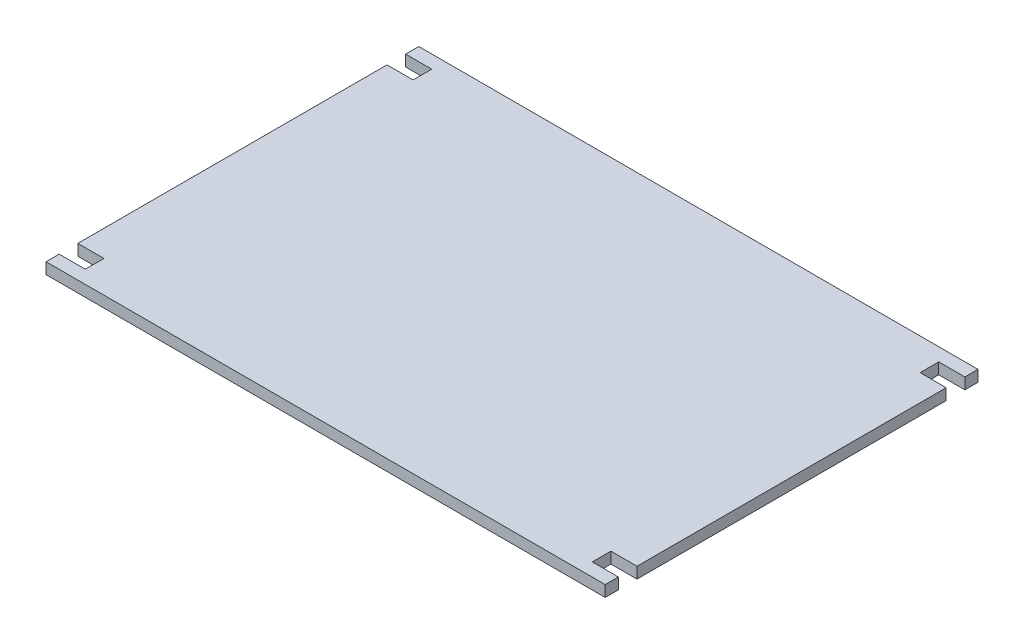
ISO-10303-21;
HEADER;
FILE_DESCRIPTION(('STEP AP214'),'2;1');
FILE_NAME('part.step','',(''),(''),'','','');
FILE_SCHEMA(('AUTOMOTIVE_DESIGN { 1 0 10303 214 1 1 1 1 }'));
ENDSEC;
DATA;
#1=APPLICATION_CONTEXT('core data for automotive mechanical design processes');
#2=APPLICATION_PROTOCOL_DEFINITION('international standard','automotive_design',2000,#1);
#3=PRODUCT_CONTEXT('',#1,'mechanical');
#4=PRODUCT('Part','Part','',(#3));
#5=PRODUCT_RELATED_PRODUCT_CATEGORY('part','',(#4));
#6=PRODUCT_DEFINITION_FORMATION('','',#4);
#7=PRODUCT_DEFINITION_CONTEXT('part definition',#1,'design');
#8=PRODUCT_DEFINITION('design','',#6,#7);
#9=PRODUCT_DEFINITION_SHAPE('','',#8);
#10=(LENGTH_UNIT() NAMED_UNIT(*) SI_UNIT(.MILLI.,.METRE.));
#11=(NAMED_UNIT(*) PLANE_ANGLE_UNIT() SI_UNIT($,.RADIAN.));
#12=(NAMED_UNIT(*) SI_UNIT($,.STERADIAN.) SOLID_ANGLE_UNIT());
#13=UNCERTAINTY_MEASURE_WITH_UNIT(LENGTH_MEASURE(1.E-05),#10,'distance_accuracy_value','');
#14=(GEOMETRIC_REPRESENTATION_CONTEXT(3) GLOBAL_UNCERTAINTY_ASSIGNED_CONTEXT((#13)) GLOBAL_UNIT_ASSIGNED_CONTEXT((#10,
#11,#12)) REPRESENTATION_CONTEXT('',''));
#15=CARTESIAN_POINT('',(0.,0.,0.));
#16=DIRECTION('',(0.,0.,1.));
#17=DIRECTION('',(1.,0.,0.));
#18=AXIS2_PLACEMENT_3D('',#15,#16,#17);
#19=CARTESIAN_POINT('',(0.,3.,0.));
#20=DIRECTION('',(1.,0.,0.));
#21=DIRECTION('',(0.,0.,-1.));
#22=AXIS2_PLACEMENT_3D('',#19,#20,#21);
#23=PLANE('',#22);
#24=DIRECTION('',(0.,0.,1.));
#25=VECTOR('',#24,1.);
#26=CARTESIAN_POINT('',(0.,3.,0.));
#27=LINE('',#26,#25);
#28=CARTESIAN_POINT('',(0.,3.,8.53345615239161));
#29=VERTEX_POINT('',#28);
#30=CARTESIAN_POINT('',(0.,3.,91.4665438476085));
#31=VERTEX_POINT('',#30);
#32=EDGE_CURVE('E286',#29,#31,#27,.T.);
#33=ORIENTED_EDGE('',*,*,#32,.F.);
#34=DIRECTION('',(0.,1.,0.));
#35=VECTOR('',#34,1.);
#36=CARTESIAN_POINT('',(0.,0.,8.53345615239161));
#37=LINE('',#36,#35);
#38=CARTESIAN_POINT('',(0.,0.,8.53345615239161));
#39=VERTEX_POINT('',#38);
#40=EDGE_CURVE('E199',#39,#29,#37,.T.);
#41=ORIENTED_EDGE('',*,*,#40,.F.);
#42=DIRECTION('',(0.,0.,1.));
#43=VECTOR('',#42,1.);
#44=CARTESIAN_POINT('',(0.,0.,0.));
#45=LINE('',#44,#43);
#46=CARTESIAN_POINT('',(0.,0.,91.4665438476085));
#47=VERTEX_POINT('',#46);
#48=EDGE_CURVE('E190',#39,#47,#45,.T.);
#49=ORIENTED_EDGE('',*,*,#48,.T.);
#50=DIRECTION('',(0.,1.,0.));
#51=VECTOR('',#50,1.);
#52=CARTESIAN_POINT('',(0.,0.,91.4665438476085));
#53=LINE('',#52,#51);
#54=EDGE_CURVE('E213',#47,#31,#53,.T.);
#55=ORIENTED_EDGE('',*,*,#54,.T.);
#56=EDGE_LOOP('',(#33,#41,#49,#55));
#57=FACE_BOUND('',#56,.T.);
#58=ADVANCED_FACE('F33',(#57),#23,.F.);
#59=CARTESIAN_POINT('',(0.,0.,0.));
#60=VERTEX_POINT('',#59);
#61=CARTESIAN_POINT('',(0.,0.,3.5334561523916));
#62=VERTEX_POINT('',#61);
#63=EDGE_CURVE('E297',#60,#62,#45,.T.);
#64=ORIENTED_EDGE('',*,*,#63,.T.);
#65=DIRECTION('',(0.,1.,0.));
#66=VECTOR('',#65,1.);
#67=CARTESIAN_POINT('',(0.,0.,3.5334561523916));
#68=LINE('',#67,#66);
#69=CARTESIAN_POINT('',(0.,3.,3.5334561523916));
#70=VERTEX_POINT('',#69);
#71=EDGE_CURVE('E202',#62,#70,#68,.T.);
#72=ORIENTED_EDGE('',*,*,#71,.T.);
#73=CARTESIAN_POINT('',(0.,3.,0.));
#74=VERTEX_POINT('',#73);
#75=EDGE_CURVE('E282',#74,#70,#27,.T.);
#76=ORIENTED_EDGE('',*,*,#75,.F.);
#77=DIRECTION('',(0.,-1.,0.));
#78=VECTOR('',#77,1.);
#79=CARTESIAN_POINT('',(0.,3.,0.));
#80=LINE('',#79,#78);
#81=EDGE_CURVE('E296',#74,#60,#80,.T.);
#82=ORIENTED_EDGE('',*,*,#81,.T.);
#83=EDGE_LOOP('',(#64,#72,#76,#82));
#84=FACE_BOUND('',#83,.T.);
#85=ADVANCED_FACE('F351',(#84),#23,.F.);
#86=CARTESIAN_POINT('',(150.,3.,0.));
#87=DIRECTION('',(-1.,0.,0.));
#88=DIRECTION('',(0.,0.,1.));
#89=AXIS2_PLACEMENT_3D('',#86,#87,#88);
#90=PLANE('',#89);
#91=DIRECTION('',(0.,0.,-1.));
#92=VECTOR('',#91,1.);
#93=CARTESIAN_POINT('',(150.,3.,0.));
#94=LINE('',#93,#92);
#95=CARTESIAN_POINT('',(150.,3.,3.53345615239156));
#96=VERTEX_POINT('',#95);
#97=CARTESIAN_POINT('',(150.,3.,0.));
#98=VERTEX_POINT('',#97);
#99=EDGE_CURVE('E289',#96,#98,#94,.T.);
#100=ORIENTED_EDGE('',*,*,#99,.F.);
#101=DIRECTION('',(0.,1.,0.));
#102=VECTOR('',#101,1.);
#103=CARTESIAN_POINT('',(150.,0.,3.53345615239156));
#104=LINE('',#103,#102);
#105=CARTESIAN_POINT('',(150.,0.,3.53345615239156));
#106=VERTEX_POINT('',#105);
#107=EDGE_CURVE('E247',#106,#96,#104,.T.);
#108=ORIENTED_EDGE('',*,*,#107,.F.);
#109=DIRECTION('',(0.,0.,-1.));
#110=VECTOR('',#109,1.);
#111=CARTESIAN_POINT('',(150.,0.,0.));
#112=LINE('',#111,#110);
#113=CARTESIAN_POINT('',(150.,0.,0.));
#114=VERTEX_POINT('',#113);
#115=EDGE_CURVE('E302',#106,#114,#112,.T.);
#116=ORIENTED_EDGE('',*,*,#115,.T.);
#117=DIRECTION('',(0.,-1.,0.));
#118=VECTOR('',#117,1.);
#119=CARTESIAN_POINT('',(150.,3.,0.));
#120=LINE('',#119,#118);
#121=EDGE_CURVE('E311',#98,#114,#120,.T.);
#122=ORIENTED_EDGE('',*,*,#121,.F.);
#123=EDGE_LOOP('',(#100,#108,#116,#122));
#124=FACE_BOUND('',#123,.T.);
#125=ADVANCED_FACE('F362',(#124),#90,.F.);
#126=CARTESIAN_POINT('',(150.,0.,100.));
#127=VERTEX_POINT('',#126);
#128=CARTESIAN_POINT('',(150.,0.,96.4665438476084));
#129=VERTEX_POINT('',#128);
#130=EDGE_CURVE('E303',#127,#129,#112,.T.);
#131=ORIENTED_EDGE('',*,*,#130,.T.);
#132=DIRECTION('',(0.,1.,0.));
#133=VECTOR('',#132,1.);
#134=CARTESIAN_POINT('',(150.,0.,96.4665438476084));
#135=LINE('',#134,#133);
#136=CARTESIAN_POINT('',(150.,3.,96.4665438476084));
#137=VERTEX_POINT('',#136);
#138=EDGE_CURVE('E273',#129,#137,#135,.T.);
#139=ORIENTED_EDGE('',*,*,#138,.T.);
#140=CARTESIAN_POINT('',(150.,3.,100.));
#141=VERTEX_POINT('',#140);
#142=EDGE_CURVE('E290',#141,#137,#94,.T.);
#143=ORIENTED_EDGE('',*,*,#142,.F.);
#144=DIRECTION('',(0.,-1.,0.));
#145=VECTOR('',#144,1.);
#146=CARTESIAN_POINT('',(150.,3.,100.));
#147=LINE('',#146,#145);
#148=EDGE_CURVE('E41',#141,#127,#147,.T.);
#149=ORIENTED_EDGE('',*,*,#148,.T.);
#150=EDGE_LOOP('',(#131,#139,#143,#149));
#151=FACE_BOUND('',#150,.T.);
#152=ADVANCED_FACE('F318',(#151),#90,.F.);
#153=CARTESIAN_POINT('',(0.,3.,96.4665438476085));
#154=VERTEX_POINT('',#153);
#155=CARTESIAN_POINT('',(0.,3.,100.));
#156=VERTEX_POINT('',#155);
#157=EDGE_CURVE('E287',#154,#156,#27,.T.);
#158=ORIENTED_EDGE('',*,*,#157,.F.);
#159=DIRECTION('',(0.,1.,0.));
#160=VECTOR('',#159,1.);
#161=CARTESIAN_POINT('',(0.,0.,96.4665438476085));
#162=LINE('',#161,#160);
#163=CARTESIAN_POINT('',(0.,0.,96.4665438476085));
#164=VERTEX_POINT('',#163);
#165=EDGE_CURVE('E226',#164,#154,#162,.T.);
#166=ORIENTED_EDGE('',*,*,#165,.F.);
#167=CARTESIAN_POINT('',(0.,0.,100.));
#168=VERTEX_POINT('',#167);
#169=EDGE_CURVE('E276',#164,#168,#45,.T.);
#170=ORIENTED_EDGE('',*,*,#169,.T.);
#171=DIRECTION('',(0.,-1.,0.));
#172=VECTOR('',#171,1.);
#173=CARTESIAN_POINT('',(0.,3.,100.));
#174=LINE('',#173,#172);
#175=EDGE_CURVE('E11',#156,#168,#174,.T.);
#176=ORIENTED_EDGE('',*,*,#175,.F.);
#177=EDGE_LOOP('',(#158,#166,#170,#176));
#178=FACE_BOUND('',#177,.T.);
#179=ADVANCED_FACE('F35',(#178),#23,.F.);
#180=CARTESIAN_POINT('',(0.,3.,100.));
#181=DIRECTION('',(0.,0.,-1.));
#182=DIRECTION('',(-1.,0.,0.));
#183=AXIS2_PLACEMENT_3D('',#180,#181,#182);
#184=PLANE('',#183);
#185=DIRECTION('',(1.,0.,0.));
#186=VECTOR('',#185,1.);
#187=CARTESIAN_POINT('',(0.,0.,100.));
#188=LINE('',#187,#186);
#189=EDGE_CURVE('E300',#168,#127,#188,.T.);
#190=ORIENTED_EDGE('',*,*,#189,.T.);
#191=ORIENTED_EDGE('',*,*,#148,.F.);
#192=DIRECTION('',(1.,0.,0.));
#193=VECTOR('',#192,1.);
#194=CARTESIAN_POINT('',(0.,3.,100.));
#195=LINE('',#194,#193);
#196=EDGE_CURVE('E285',#156,#141,#195,.T.);
#197=ORIENTED_EDGE('',*,*,#196,.F.);
#198=ORIENTED_EDGE('',*,*,#175,.T.);
#199=EDGE_LOOP('',(#190,#191,#197,#198));
#200=FACE_BOUND('',#199,.T.);
#201=ADVANCED_FACE('F333',(#200),#184,.F.);
#202=CARTESIAN_POINT('',(150.,0.,91.4665438476084));
#203=VERTEX_POINT('',#202);
#204=CARTESIAN_POINT('',(150.,0.,8.53345615239157));
#205=VERTEX_POINT('',#204);
#206=EDGE_CURVE('E307',#203,#205,#112,.T.);
#207=ORIENTED_EDGE('',*,*,#206,.T.);
#208=DIRECTION('',(0.,1.,0.));
#209=VECTOR('',#208,1.);
#210=CARTESIAN_POINT('',(150.,0.,8.53345615239157));
#211=LINE('',#210,#209);
#212=CARTESIAN_POINT('',(150.,3.,8.53345615239157));
#213=VERTEX_POINT('',#212);
#214=EDGE_CURVE('E250',#205,#213,#211,.T.);
#215=ORIENTED_EDGE('',*,*,#214,.T.);
#216=CARTESIAN_POINT('',(150.,3.,91.4665438476084));
#217=VERTEX_POINT('',#216);
#218=EDGE_CURVE('E294',#217,#213,#94,.T.);
#219=ORIENTED_EDGE('',*,*,#218,.F.);
#220=DIRECTION('',(0.,1.,0.));
#221=VECTOR('',#220,1.);
#222=CARTESIAN_POINT('',(150.,0.,91.4665438476084));
#223=LINE('',#222,#221);
#224=EDGE_CURVE('E266',#203,#217,#223,.T.);
#225=ORIENTED_EDGE('',*,*,#224,.F.);
#226=EDGE_LOOP('',(#207,#215,#219,#225));
#227=FACE_BOUND('',#226,.T.);
#228=ADVANCED_FACE('F368',(#227),#90,.F.);
#229=CARTESIAN_POINT('',(0.,3.,0.));
#230=DIRECTION('',(0.,0.,1.));
#231=DIRECTION('',(1.,0.,0.));
#232=AXIS2_PLACEMENT_3D('',#229,#230,#231);
#233=PLANE('',#232);
#234=DIRECTION('',(-1.,0.,0.));
#235=VECTOR('',#234,1.);
#236=CARTESIAN_POINT('',(0.,0.,0.));
#237=LINE('',#236,#235);
#238=EDGE_CURVE('E306',#114,#60,#237,.T.);
#239=ORIENTED_EDGE('',*,*,#238,.T.);
#240=ORIENTED_EDGE('',*,*,#81,.F.);
#241=DIRECTION('',(-1.,0.,0.));
#242=VECTOR('',#241,1.);
#243=CARTESIAN_POINT('',(0.,3.,0.));
#244=LINE('',#243,#242);
#245=EDGE_CURVE('E293',#98,#74,#244,.T.);
#246=ORIENTED_EDGE('',*,*,#245,.F.);
#247=ORIENTED_EDGE('',*,*,#121,.T.);
#248=EDGE_LOOP('',(#239,#240,#246,#247));
#249=FACE_BOUND('',#248,.T.);
#250=ADVANCED_FACE('F357',(#249),#233,.F.);
#251=CARTESIAN_POINT('',(0.,3.,0.));
#252=DIRECTION('',(0.,1.,0.));
#253=DIRECTION('',(0.,0.,1.));
#254=AXIS2_PLACEMENT_3D('',#251,#252,#253);
#255=PLANE('',#254);
#256=DIRECTION('',(1.,0.,0.));
#257=VECTOR('',#256,1.);
#258=CARTESIAN_POINT('',(6.99999999999998,3.,8.5334561523916));
#259=LINE('',#258,#257);
#260=CARTESIAN_POINT('',(6.99999999999998,3.,8.5334561523916));
#261=VERTEX_POINT('',#260);
#262=EDGE_CURVE('E176',#29,#261,#259,.T.);
#263=ORIENTED_EDGE('',*,*,#262,.F.);
#264=ORIENTED_EDGE('',*,*,#32,.T.);
#265=DIRECTION('',(-1.,0.,0.));
#266=VECTOR('',#265,1.);
#267=CARTESIAN_POINT('',(7.00000000000003,3.,91.4665438476085));
#268=LINE('',#267,#266);
#269=CARTESIAN_POINT('',(7.00000000000003,3.,91.4665438476085));
#270=VERTEX_POINT('',#269);
#271=EDGE_CURVE('E201',#270,#31,#268,.T.);
#272=ORIENTED_EDGE('',*,*,#271,.F.);
#273=DIRECTION('',(0.,0.,-1.));
#274=VECTOR('',#273,1.);
#275=CARTESIAN_POINT('',(7.00000000000003,3.,96.4665438476085));
#276=LINE('',#275,#274);
#277=CARTESIAN_POINT('',(7.00000000000003,3.,96.4665438476085));
#278=VERTEX_POINT('',#277);
#279=EDGE_CURVE('E209',#278,#270,#276,.T.);
#280=ORIENTED_EDGE('',*,*,#279,.F.);
#281=DIRECTION('',(1.,0.,0.));
#282=VECTOR('',#281,1.);
#283=CARTESIAN_POINT('',(0.,3.,96.4665438476085));
#284=LINE('',#283,#282);
#285=EDGE_CURVE('E216',#154,#278,#284,.T.);
#286=ORIENTED_EDGE('',*,*,#285,.F.);
#287=ORIENTED_EDGE('',*,*,#157,.T.);
#288=ORIENTED_EDGE('',*,*,#196,.T.);
#289=ORIENTED_EDGE('',*,*,#142,.T.);
#290=DIRECTION('',(1.,0.,0.));
#291=VECTOR('',#290,1.);
#292=CARTESIAN_POINT('',(150.,3.,96.4665438476084));
#293=LINE('',#292,#291);
#294=CARTESIAN_POINT('',(143.,3.,96.4665438476084));
#295=VERTEX_POINT('',#294);
#296=EDGE_CURVE('E260',#295,#137,#293,.T.);
#297=ORIENTED_EDGE('',*,*,#296,.F.);
#298=DIRECTION('',(0.,0.,1.));
#299=VECTOR('',#298,1.);
#300=CARTESIAN_POINT('',(143.,3.,96.4665438476084));
#301=LINE('',#300,#299);
#302=CARTESIAN_POINT('',(143.,3.,91.4665438476084));
#303=VERTEX_POINT('',#302);
#304=EDGE_CURVE('E269',#303,#295,#301,.T.);
#305=ORIENTED_EDGE('',*,*,#304,.F.);
#306=DIRECTION('',(-1.,0.,0.));
#307=VECTOR('',#306,1.);
#308=CARTESIAN_POINT('',(143.,3.,91.4665438476084));
#309=LINE('',#308,#307);
#310=EDGE_CURVE('E249',#217,#303,#309,.T.);
#311=ORIENTED_EDGE('',*,*,#310,.F.);
#312=ORIENTED_EDGE('',*,*,#218,.T.);
#313=DIRECTION('',(1.,0.,0.));
#314=VECTOR('',#313,1.);
#315=CARTESIAN_POINT('',(143.,3.,8.53345615239157));
#316=LINE('',#315,#314);
#317=CARTESIAN_POINT('',(143.,3.,8.53345615239157));
#318=VERTEX_POINT('',#317);
#319=EDGE_CURVE('E234',#318,#213,#316,.T.);
#320=ORIENTED_EDGE('',*,*,#319,.F.);
#321=DIRECTION('',(0.,0.,1.));
#322=VECTOR('',#321,1.);
#323=CARTESIAN_POINT('',(143.,3.,3.53345615239156));
#324=LINE('',#323,#322);
#325=CARTESIAN_POINT('',(143.,3.,3.53345615239156));
#326=VERTEX_POINT('',#325);
#327=EDGE_CURVE('E243',#326,#318,#324,.T.);
#328=ORIENTED_EDGE('',*,*,#327,.F.);
#329=DIRECTION('',(-1.,0.,0.));
#330=VECTOR('',#329,1.);
#331=CARTESIAN_POINT('',(150.,3.,3.53345615239156));
#332=LINE('',#331,#330);
#333=EDGE_CURVE('E223',#96,#326,#332,.T.);
#334=ORIENTED_EDGE('',*,*,#333,.F.);
#335=ORIENTED_EDGE('',*,*,#99,.T.);
#336=ORIENTED_EDGE('',*,*,#245,.T.);
#337=ORIENTED_EDGE('',*,*,#75,.T.);
#338=DIRECTION('',(-1.,0.,0.));
#339=VECTOR('',#338,1.);
#340=CARTESIAN_POINT('',(0.,3.,3.5334561523916));
#341=LINE('',#340,#339);
#342=CARTESIAN_POINT('',(6.99999999999998,3.,3.5334561523916));
#343=VERTEX_POINT('',#342);
#344=EDGE_CURVE('E191',#343,#70,#341,.T.);
#345=ORIENTED_EDGE('',*,*,#344,.F.);
#346=DIRECTION('',(0.,0.,-1.));
#347=VECTOR('',#346,1.);
#348=CARTESIAN_POINT('',(6.99999999999998,3.,3.5334561523916));
#349=LINE('',#348,#347);
#350=EDGE_CURVE('E193',#261,#343,#349,.T.);
#351=ORIENTED_EDGE('',*,*,#350,.F.);
#352=EDGE_LOOP('',(#263,#264,#272,#280,#286,#287,#288,#289,#297,#305,#311,#312,#320,#328,#334,
#335,#336,#337,#345,#351));
#353=FACE_BOUND('',#352,.T.);
#354=ADVANCED_FACE('F328',(#353),#255,.T.);
#355=CARTESIAN_POINT('',(0.,0.,0.));
#356=DIRECTION('',(0.,1.,0.));
#357=DIRECTION('',(0.,0.,1.));
#358=AXIS2_PLACEMENT_3D('',#355,#356,#357);
#359=PLANE('',#358);
#360=ORIENTED_EDGE('',*,*,#48,.F.);
#361=DIRECTION('',(1.,0.,0.));
#362=VECTOR('',#361,1.);
#363=CARTESIAN_POINT('',(6.99999999999998,0.,8.5334561523916));
#364=LINE('',#363,#362);
#365=CARTESIAN_POINT('',(6.99999999999998,0.,8.5334561523916));
#366=VERTEX_POINT('',#365);
#367=EDGE_CURVE('E173',#39,#366,#364,.T.);
#368=ORIENTED_EDGE('',*,*,#367,.T.);
#369=DIRECTION('',(0.,0.,-1.));
#370=VECTOR('',#369,1.);
#371=CARTESIAN_POINT('',(6.99999999999998,0.,3.5334561523916));
#372=LINE('',#371,#370);
#373=CARTESIAN_POINT('',(6.99999999999998,0.,3.5334561523916));
#374=VERTEX_POINT('',#373);
#375=EDGE_CURVE('E183',#366,#374,#372,.T.);
#376=ORIENTED_EDGE('',*,*,#375,.T.);
#377=DIRECTION('',(-1.,0.,0.));
#378=VECTOR('',#377,1.);
#379=CARTESIAN_POINT('',(0.,0.,3.5334561523916));
#380=LINE('',#379,#378);
#381=EDGE_CURVE('E48',#374,#62,#380,.T.);
#382=ORIENTED_EDGE('',*,*,#381,.T.);
#383=ORIENTED_EDGE('',*,*,#63,.F.);
#384=ORIENTED_EDGE('',*,*,#238,.F.);
#385=ORIENTED_EDGE('',*,*,#115,.F.);
#386=DIRECTION('',(-1.,0.,0.));
#387=VECTOR('',#386,1.);
#388=CARTESIAN_POINT('',(150.,0.,3.53345615239156));
#389=LINE('',#388,#387);
#390=CARTESIAN_POINT('',(143.,0.,3.53345615239156));
#391=VERTEX_POINT('',#390);
#392=EDGE_CURVE('E230',#106,#391,#389,.T.);
#393=ORIENTED_EDGE('',*,*,#392,.T.);
#394=DIRECTION('',(0.,0.,1.));
#395=VECTOR('',#394,1.);
#396=CARTESIAN_POINT('',(143.,0.,3.53345615239156));
#397=LINE('',#396,#395);
#398=CARTESIAN_POINT('',(143.,0.,8.53345615239157));
#399=VERTEX_POINT('',#398);
#400=EDGE_CURVE('E233',#391,#399,#397,.T.);
#401=ORIENTED_EDGE('',*,*,#400,.T.);
#402=DIRECTION('',(1.,0.,0.));
#403=VECTOR('',#402,1.);
#404=CARTESIAN_POINT('',(143.,0.,8.53345615239157));
#405=LINE('',#404,#403);
#406=EDGE_CURVE('E237',#399,#205,#405,.T.);
#407=ORIENTED_EDGE('',*,*,#406,.T.);
#408=ORIENTED_EDGE('',*,*,#206,.F.);
#409=DIRECTION('',(-1.,0.,0.));
#410=VECTOR('',#409,1.);
#411=CARTESIAN_POINT('',(143.,0.,91.4665438476084));
#412=LINE('',#411,#410);
#413=CARTESIAN_POINT('',(143.,0.,91.4665438476084));
#414=VERTEX_POINT('',#413);
#415=EDGE_CURVE('E256',#203,#414,#412,.T.);
#416=ORIENTED_EDGE('',*,*,#415,.T.);
#417=DIRECTION('',(0.,0.,1.));
#418=VECTOR('',#417,1.);
#419=CARTESIAN_POINT('',(143.,0.,96.4665438476084));
#420=LINE('',#419,#418);
#421=CARTESIAN_POINT('',(143.,0.,96.4665438476084));
#422=VERTEX_POINT('',#421);
#423=EDGE_CURVE('E259',#414,#422,#420,.T.);
#424=ORIENTED_EDGE('',*,*,#423,.T.);
#425=DIRECTION('',(1.,0.,0.));
#426=VECTOR('',#425,1.);
#427=CARTESIAN_POINT('',(150.,0.,96.4665438476084));
#428=LINE('',#427,#426);
#429=EDGE_CURVE('E263',#422,#129,#428,.T.);
#430=ORIENTED_EDGE('',*,*,#429,.T.);
#431=ORIENTED_EDGE('',*,*,#130,.F.);
#432=ORIENTED_EDGE('',*,*,#189,.F.);
#433=ORIENTED_EDGE('',*,*,#169,.F.);
#434=DIRECTION('',(1.,0.,0.));
#435=VECTOR('',#434,1.);
#436=CARTESIAN_POINT('',(0.,0.,96.4665438476085));
#437=LINE('',#436,#435);
#438=CARTESIAN_POINT('',(7.00000000000003,0.,96.4665438476085));
#439=VERTEX_POINT('',#438);
#440=EDGE_CURVE('E208',#164,#439,#437,.T.);
#441=ORIENTED_EDGE('',*,*,#440,.T.);
#442=DIRECTION('',(0.,0.,-1.));
#443=VECTOR('',#442,1.);
#444=CARTESIAN_POINT('',(7.00000000000003,0.,96.4665438476085));
#445=LINE('',#444,#443);
#446=CARTESIAN_POINT('',(7.00000000000003,0.,91.4665438476085));
#447=VERTEX_POINT('',#446);
#448=EDGE_CURVE('E56',#439,#447,#445,.T.);
#449=ORIENTED_EDGE('',*,*,#448,.T.);
#450=DIRECTION('',(-1.,0.,0.));
#451=VECTOR('',#450,1.);
#452=CARTESIAN_POINT('',(7.00000000000003,0.,91.4665438476085));
#453=LINE('',#452,#451);
#454=EDGE_CURVE('E206',#447,#47,#453,.T.);
#455=ORIENTED_EDGE('',*,*,#454,.T.);
#456=EDGE_LOOP('',(#360,#368,#376,#382,#383,#384,#385,#393,#401,#407,#408,#416,#424,#430,#431,
#432,#433,#441,#449,#455));
#457=FACE_BOUND('',#456,.T.);
#458=ADVANCED_FACE('F188',(#457),#359,.F.);
#459=CARTESIAN_POINT('',(150.,0.,96.4665438476084));
#460=DIRECTION('',(0.,0.,1.));
#461=DIRECTION('',(1.,0.,0.));
#462=AXIS2_PLACEMENT_3D('',#459,#460,#461);
#463=PLANE('',#462);
#464=ORIENTED_EDGE('',*,*,#296,.T.);
#465=ORIENTED_EDGE('',*,*,#138,.F.);
#466=ORIENTED_EDGE('',*,*,#429,.F.);
#467=DIRECTION('',(0.,1.,0.));
#468=VECTOR('',#467,1.);
#469=CARTESIAN_POINT('',(143.,0.,96.4665438476084));
#470=LINE('',#469,#468);
#471=EDGE_CURVE('E277',#422,#295,#470,.T.);
#472=ORIENTED_EDGE('',*,*,#471,.T.);
#473=EDGE_LOOP('',(#464,#465,#466,#472));
#474=FACE_BOUND('',#473,.T.);
#475=ADVANCED_FACE('F325',(#474),#463,.F.);
#476=CARTESIAN_POINT('',(143.,0.,96.4665438476084));
#477=DIRECTION('',(-1.,0.,0.));
#478=DIRECTION('',(0.,0.,1.));
#479=AXIS2_PLACEMENT_3D('',#476,#477,#478);
#480=PLANE('',#479);
#481=ORIENTED_EDGE('',*,*,#304,.T.);
#482=ORIENTED_EDGE('',*,*,#471,.F.);
#483=ORIENTED_EDGE('',*,*,#423,.F.);
#484=DIRECTION('',(0.,1.,0.));
#485=VECTOR('',#484,1.);
#486=CARTESIAN_POINT('',(143.,0.,91.4665438476084));
#487=LINE('',#486,#485);
#488=EDGE_CURVE('E279',#414,#303,#487,.T.);
#489=ORIENTED_EDGE('',*,*,#488,.T.);
#490=EDGE_LOOP('',(#481,#482,#483,#489));
#491=FACE_BOUND('',#490,.T.);
#492=ADVANCED_FACE('F391',(#491),#480,.F.);
#493=CARTESIAN_POINT('',(143.,0.,91.4665438476084));
#494=DIRECTION('',(0.,0.,-1.));
#495=DIRECTION('',(-1.,0.,0.));
#496=AXIS2_PLACEMENT_3D('',#493,#494,#495);
#497=PLANE('',#496);
#498=ORIENTED_EDGE('',*,*,#310,.T.);
#499=ORIENTED_EDGE('',*,*,#488,.F.);
#500=ORIENTED_EDGE('',*,*,#415,.F.);
#501=ORIENTED_EDGE('',*,*,#224,.T.);
#502=EDGE_LOOP('',(#498,#499,#500,#501));
#503=FACE_BOUND('',#502,.T.);
#504=ADVANCED_FACE('F384',(#503),#497,.F.);
#505=CARTESIAN_POINT('',(150.,0.,3.53345615239156));
#506=DIRECTION('',(0.,0.,-1.));
#507=DIRECTION('',(-1.,0.,0.));
#508=AXIS2_PLACEMENT_3D('',#505,#506,#507);
#509=PLANE('',#508);
#510=ORIENTED_EDGE('',*,*,#333,.T.);
#511=DIRECTION('',(0.,1.,0.));
#512=VECTOR('',#511,1.);
#513=CARTESIAN_POINT('',(143.,0.,3.53345615239156));
#514=LINE('',#513,#512);
#515=EDGE_CURVE('E240',#391,#326,#514,.T.);
#516=ORIENTED_EDGE('',*,*,#515,.F.);
#517=ORIENTED_EDGE('',*,*,#392,.F.);
#518=ORIENTED_EDGE('',*,*,#107,.T.);
#519=EDGE_LOOP('',(#510,#516,#517,#518));
#520=FACE_BOUND('',#519,.T.);
#521=ADVANCED_FACE('F382',(#520),#509,.F.);
#522=CARTESIAN_POINT('',(143.,0.,8.53345615239157));
#523=DIRECTION('',(0.,0.,1.));
#524=DIRECTION('',(1.,0.,0.));
#525=AXIS2_PLACEMENT_3D('',#522,#523,#524);
#526=PLANE('',#525);
#527=ORIENTED_EDGE('',*,*,#319,.T.);
#528=ORIENTED_EDGE('',*,*,#214,.F.);
#529=ORIENTED_EDGE('',*,*,#406,.F.);
#530=DIRECTION('',(0.,1.,0.));
#531=VECTOR('',#530,1.);
#532=CARTESIAN_POINT('',(143.,0.,8.53345615239157));
#533=LINE('',#532,#531);
#534=EDGE_CURVE('E253',#399,#318,#533,.T.);
#535=ORIENTED_EDGE('',*,*,#534,.T.);
#536=EDGE_LOOP('',(#527,#528,#529,#535));
#537=FACE_BOUND('',#536,.T.);
#538=ADVANCED_FACE('F374',(#537),#526,.F.);
#539=CARTESIAN_POINT('',(143.,0.,3.53345615239156));
#540=DIRECTION('',(-1.,0.,0.));
#541=DIRECTION('',(0.,0.,1.));
#542=AXIS2_PLACEMENT_3D('',#539,#540,#541);
#543=PLANE('',#542);
#544=ORIENTED_EDGE('',*,*,#327,.T.);
#545=ORIENTED_EDGE('',*,*,#534,.F.);
#546=ORIENTED_EDGE('',*,*,#400,.F.);
#547=ORIENTED_EDGE('',*,*,#515,.T.);
#548=EDGE_LOOP('',(#544,#545,#546,#547));
#549=FACE_BOUND('',#548,.T.);
#550=ADVANCED_FACE('F376',(#549),#543,.F.);
#551=CARTESIAN_POINT('',(7.00000000000003,0.,91.4665438476085));
#552=DIRECTION('',(0.,0.,-1.));
#553=DIRECTION('',(-1.,0.,0.));
#554=AXIS2_PLACEMENT_3D('',#551,#552,#553);
#555=PLANE('',#554);
#556=ORIENTED_EDGE('',*,*,#271,.T.);
#557=ORIENTED_EDGE('',*,*,#54,.F.);
#558=ORIENTED_EDGE('',*,*,#454,.F.);
#559=DIRECTION('',(0.,1.,0.));
#560=VECTOR('',#559,1.);
#561=CARTESIAN_POINT('',(7.00000000000003,0.,91.4665438476085));
#562=LINE('',#561,#560);
#563=EDGE_CURVE('E221',#447,#270,#562,.T.);
#564=ORIENTED_EDGE('',*,*,#563,.T.);
#565=EDGE_LOOP('',(#556,#557,#558,#564));
#566=FACE_BOUND('',#565,.T.);
#567=ADVANCED_FACE('F341',(#566),#555,.F.);
#568=CARTESIAN_POINT('',(7.00000000000003,0.,96.4665438476085));
#569=DIRECTION('',(1.,0.,0.));
#570=DIRECTION('',(0.,0.,-1.));
#571=AXIS2_PLACEMENT_3D('',#568,#569,#570);
#572=PLANE('',#571);
#573=ORIENTED_EDGE('',*,*,#279,.T.);
#574=ORIENTED_EDGE('',*,*,#563,.F.);
#575=ORIENTED_EDGE('',*,*,#448,.F.);
#576=DIRECTION('',(0.,1.,0.));
#577=VECTOR('',#576,1.);
#578=CARTESIAN_POINT('',(7.00000000000003,0.,96.4665438476085));
#579=LINE('',#578,#577);
#580=EDGE_CURVE('E224',#439,#278,#579,.T.);
#581=ORIENTED_EDGE('',*,*,#580,.T.);
#582=EDGE_LOOP('',(#573,#574,#575,#581));
#583=FACE_BOUND('',#582,.T.);
#584=ADVANCED_FACE('F346',(#583),#572,.F.);
#585=CARTESIAN_POINT('',(0.,0.,96.4665438476085));
#586=DIRECTION('',(0.,0.,1.));
#587=DIRECTION('',(1.,0.,0.));
#588=AXIS2_PLACEMENT_3D('',#585,#586,#587);
#589=PLANE('',#588);
#590=ORIENTED_EDGE('',*,*,#285,.T.);
#591=ORIENTED_EDGE('',*,*,#580,.F.);
#592=ORIENTED_EDGE('',*,*,#440,.F.);
#593=ORIENTED_EDGE('',*,*,#165,.T.);
#594=EDGE_LOOP('',(#590,#591,#592,#593));
#595=FACE_BOUND('',#594,.T.);
#596=ADVANCED_FACE('F344',(#595),#589,.F.);
#597=CARTESIAN_POINT('',(6.99999999999998,0.,8.5334561523916));
#598=DIRECTION('',(0.,0.,1.));
#599=DIRECTION('',(1.,0.,0.));
#600=AXIS2_PLACEMENT_3D('',#597,#598,#599);
#601=PLANE('',#600);
#602=ORIENTED_EDGE('',*,*,#262,.T.);
#603=DIRECTION('',(0.,1.,0.));
#604=VECTOR('',#603,1.);
#605=CARTESIAN_POINT('',(6.99999999999998,0.,8.5334561523916));
#606=LINE('',#605,#604);
#607=EDGE_CURVE('E169',#366,#261,#606,.T.);
#608=ORIENTED_EDGE('',*,*,#607,.F.);
#609=ORIENTED_EDGE('',*,*,#367,.F.);
#610=ORIENTED_EDGE('',*,*,#40,.T.);
#611=EDGE_LOOP('',(#602,#608,#609,#610));
#612=FACE_BOUND('',#611,.T.);
#613=ADVANCED_FACE('F171',(#612),#601,.F.);
#614=CARTESIAN_POINT('',(0.,0.,3.5334561523916));
#615=DIRECTION('',(0.,0.,-1.));
#616=DIRECTION('',(-1.,0.,0.));
#617=AXIS2_PLACEMENT_3D('',#614,#615,#616);
#618=PLANE('',#617);
#619=ORIENTED_EDGE('',*,*,#344,.T.);
#620=ORIENTED_EDGE('',*,*,#71,.F.);
#621=ORIENTED_EDGE('',*,*,#381,.F.);
#622=DIRECTION('',(0.,1.,0.));
#623=VECTOR('',#622,1.);
#624=CARTESIAN_POINT('',(6.99999999999998,0.,3.5334561523916));
#625=LINE('',#624,#623);
#626=EDGE_CURVE('E180',#374,#343,#625,.T.);
#627=ORIENTED_EDGE('',*,*,#626,.T.);
#628=EDGE_LOOP('',(#619,#620,#621,#627));
#629=FACE_BOUND('',#628,.T.);
#630=ADVANCED_FACE('F349',(#629),#618,.F.);
#631=CARTESIAN_POINT('',(6.99999999999998,0.,3.5334561523916));
#632=DIRECTION('',(1.,0.,0.));
#633=DIRECTION('',(0.,0.,-1.));
#634=AXIS2_PLACEMENT_3D('',#631,#632,#633);
#635=PLANE('',#634);
#636=ORIENTED_EDGE('',*,*,#350,.T.);
#637=ORIENTED_EDGE('',*,*,#626,.F.);
#638=ORIENTED_EDGE('',*,*,#375,.F.);
#639=ORIENTED_EDGE('',*,*,#607,.T.);
#640=EDGE_LOOP('',(#636,#637,#638,#639));
#641=FACE_BOUND('',#640,.T.);
#642=ADVANCED_FACE('F184',(#641),#635,.F.);
#643=CLOSED_SHELL('',(#58,#85,#125,#152,#179,#201,#228,#250,#354,#458,#475,#492,#504,#521,#538,
#550,#567,#584,#596,#613,#630,#642));
#644=MANIFOLD_SOLID_BREP('B2',#643);
#645=ADVANCED_BREP_SHAPE_REPRESENTATION('',(#18,#644),#14);
#646=SHAPE_DEFINITION_REPRESENTATION(#9,#645);
ENDSEC;
END-ISO-10303-21;
